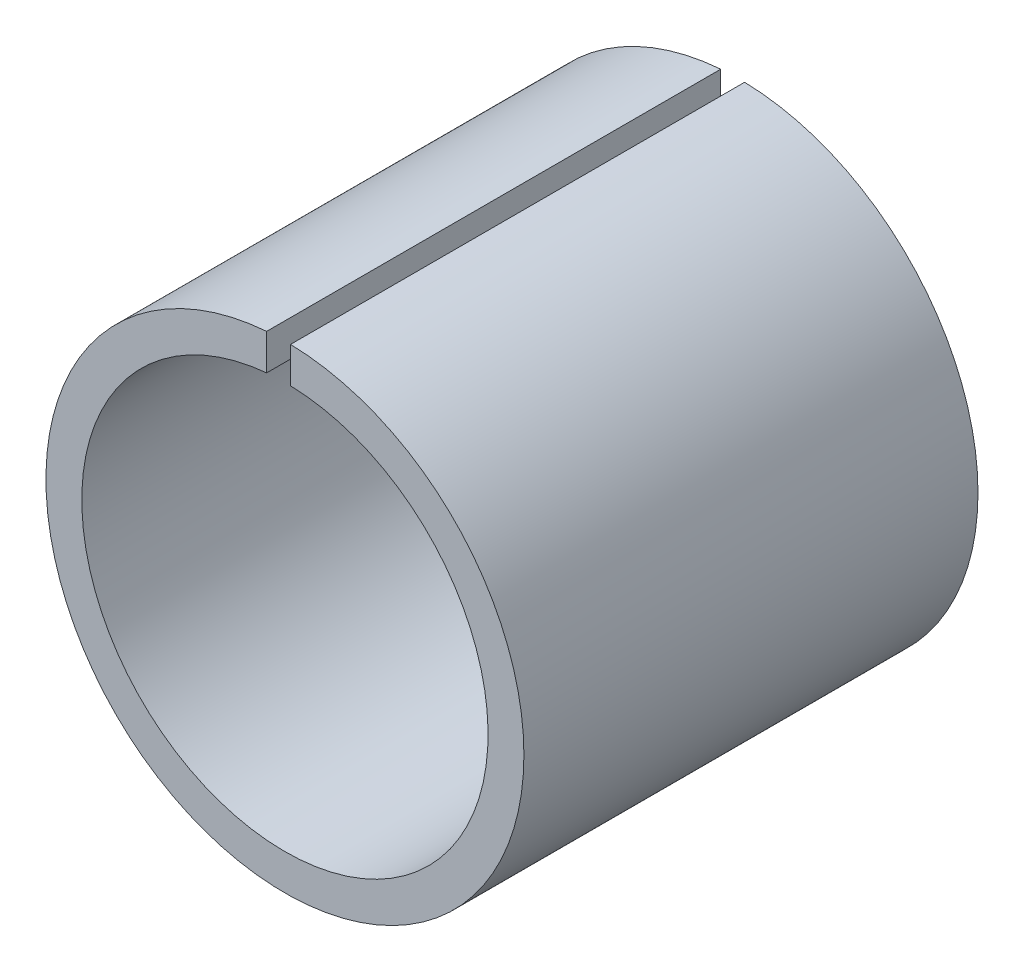
ISO-10303-21;
HEADER;
FILE_DESCRIPTION(('STEP AP214'),'2;1');
FILE_NAME('part.step','',(''),(''),'','','');
FILE_SCHEMA(('AUTOMOTIVE_DESIGN { 1 0 10303 214 1 1 1 1 }'));
ENDSEC;
DATA;
#1=APPLICATION_CONTEXT('core data for automotive mechanical design processes');
#2=APPLICATION_PROTOCOL_DEFINITION('international standard','automotive_design',2000,#1);
#3=PRODUCT_CONTEXT('',#1,'mechanical');
#4=PRODUCT('Part','Part','',(#3));
#5=PRODUCT_RELATED_PRODUCT_CATEGORY('part','',(#4));
#6=PRODUCT_DEFINITION_FORMATION('','',#4);
#7=PRODUCT_DEFINITION_CONTEXT('part definition',#1,'design');
#8=PRODUCT_DEFINITION('design','',#6,#7);
#9=PRODUCT_DEFINITION_SHAPE('','',#8);
#10=(LENGTH_UNIT() NAMED_UNIT(*) SI_UNIT(.MILLI.,.METRE.));
#11=(NAMED_UNIT(*) PLANE_ANGLE_UNIT() SI_UNIT($,.RADIAN.));
#12=(NAMED_UNIT(*) SI_UNIT($,.STERADIAN.) SOLID_ANGLE_UNIT());
#13=UNCERTAINTY_MEASURE_WITH_UNIT(LENGTH_MEASURE(1.E-05),#10,'distance_accuracy_value','');
#14=(GEOMETRIC_REPRESENTATION_CONTEXT(3) GLOBAL_UNCERTAINTY_ASSIGNED_CONTEXT((#13)) GLOBAL_UNIT_ASSIGNED_CONTEXT((#10,
#11,#12)) REPRESENTATION_CONTEXT('',''));
#15=CARTESIAN_POINT('',(0.,0.,0.));
#16=DIRECTION('',(0.,0.,1.));
#17=DIRECTION('',(1.,0.,0.));
#18=AXIS2_PLACEMENT_3D('',#15,#16,#17);
#19=CARTESIAN_POINT('',(0.,0.,19.));
#20=DIRECTION('',(0.,0.,-1.));
#21=DIRECTION('',(-1.,0.,0.));
#22=AXIS2_PLACEMENT_3D('',#19,#20,#21);
#23=CYLINDRICAL_SURFACE('',#22,10.);
#24=DIRECTION('',(0.,0.,-1.));
#25=VECTOR('',#24,1.);
#26=CARTESIAN_POINT('',(-0.765251335992105,9.97067652633272,19.));
#27=LINE('',#26,#25);
#28=CARTESIAN_POINT('',(-0.765251335992104,9.97067652633272,0.));
#29=VERTEX_POINT('',#28);
#30=CARTESIAN_POINT('',(-0.765251335992105,9.97067652633272,19.));
#31=VERTEX_POINT('',#30);
#32=EDGE_CURVE('E76',#29,#31,#27,.F.);
#33=ORIENTED_EDGE('',*,*,#32,.F.);
#34=CARTESIAN_POINT('',(0.,0.,0.));
#35=DIRECTION('',(0.,0.,1.));
#36=DIRECTION('',(1.,0.,0.));
#37=AXIS2_PLACEMENT_3D('',#34,#35,#36);
#38=CIRCLE('',#37,10.);
#39=CARTESIAN_POINT('',(0.234748664007892,9.99724427353591,0.));
#40=VERTEX_POINT('',#39);
#41=EDGE_CURVE('E86',#29,#40,#38,.T.);
#42=ORIENTED_EDGE('',*,*,#41,.T.);
#43=DIRECTION('',(0.,0.,-1.));
#44=VECTOR('',#43,1.);
#45=CARTESIAN_POINT('',(0.234748664007895,9.99724427353591,19.));
#46=LINE('',#45,#44);
#47=CARTESIAN_POINT('',(0.234748664007895,9.99724427353591,19.));
#48=VERTEX_POINT('',#47);
#49=EDGE_CURVE('E90',#48,#40,#46,.T.);
#50=ORIENTED_EDGE('',*,*,#49,.F.);
#51=CARTESIAN_POINT('',(0.,0.,19.));
#52=DIRECTION('',(0.,0.,1.));
#53=DIRECTION('',(1.,0.,0.));
#54=AXIS2_PLACEMENT_3D('',#51,#52,#53);
#55=CIRCLE('',#54,10.);
#56=EDGE_CURVE('E88',#31,#48,#55,.T.);
#57=ORIENTED_EDGE('',*,*,#56,.F.);
#58=EDGE_LOOP('',(#33,#42,#50,#57));
#59=FACE_BOUND('',#58,.T.);
#60=ADVANCED_FACE('F36',(#59),#23,.T.);
#61=CARTESIAN_POINT('',(0.,0.,19.));
#62=DIRECTION('',(0.,0.,1.));
#63=DIRECTION('',(1.,0.,0.));
#64=AXIS2_PLACEMENT_3D('',#61,#62,#63);
#65=PLANE('',#64);
#66=CARTESIAN_POINT('',(0.,0.,19.));
#67=DIRECTION('',(0.,0.,1.));
#68=DIRECTION('',(1.,0.,0.));
#69=AXIS2_PLACEMENT_3D('',#66,#67,#68);
#70=CIRCLE('',#69,8.5);
#71=CARTESIAN_POINT('',(-0.765251335992106,8.46548228943646,19.));
#72=VERTEX_POINT('',#71);
#73=CARTESIAN_POINT('',(0.234748664007895,8.49675779722751,19.));
#74=VERTEX_POINT('',#73);
#75=EDGE_CURVE('E89',#72,#74,#70,.T.);
#76=ORIENTED_EDGE('',*,*,#75,.F.);
#77=DIRECTION('',(0.,-1.,0.));
#78=VECTOR('',#77,1.);
#79=CARTESIAN_POINT('',(-0.765251335992105,11.,19.));
#80=LINE('',#79,#78);
#81=EDGE_CURVE('E49',#31,#72,#80,.T.);
#82=ORIENTED_EDGE('',*,*,#81,.F.);
#83=ORIENTED_EDGE('',*,*,#56,.T.);
#84=DIRECTION('',(0.,-1.,0.));
#85=VECTOR('',#84,1.);
#86=CARTESIAN_POINT('',(0.234748664007895,11.,19.));
#87=LINE('',#86,#85);
#88=EDGE_CURVE('E100',#48,#74,#87,.T.);
#89=ORIENTED_EDGE('',*,*,#88,.T.);
#90=EDGE_LOOP('',(#76,#82,#83,#89));
#91=FACE_BOUND('',#90,.T.);
#92=ADVANCED_FACE('F105',(#91),#65,.T.);
#93=CARTESIAN_POINT('',(0.,0.,0.));
#94=DIRECTION('',(0.,0.,1.));
#95=DIRECTION('',(1.,0.,0.));
#96=AXIS2_PLACEMENT_3D('',#93,#94,#95);
#97=PLANE('',#96);
#98=DIRECTION('',(0.,-1.,0.));
#99=VECTOR('',#98,1.);
#100=CARTESIAN_POINT('',(-0.765251335992104,11.,0.));
#101=LINE('',#100,#99);
#102=CARTESIAN_POINT('',(-0.765251335992104,8.46548228943645,0.));
#103=VERTEX_POINT('',#102);
#104=EDGE_CURVE('E73',#29,#103,#101,.T.);
#105=ORIENTED_EDGE('',*,*,#104,.T.);
#106=CARTESIAN_POINT('',(0.,0.,0.));
#107=DIRECTION('',(0.,0.,1.));
#108=DIRECTION('',(1.,0.,0.));
#109=AXIS2_PLACEMENT_3D('',#106,#107,#108);
#110=CIRCLE('',#109,8.5);
#111=CARTESIAN_POINT('',(0.234748664007892,8.49675779722751,0.));
#112=VERTEX_POINT('',#111);
#113=EDGE_CURVE('E93',#103,#112,#110,.T.);
#114=ORIENTED_EDGE('',*,*,#113,.T.);
#115=DIRECTION('',(0.,-1.,0.));
#116=VECTOR('',#115,1.);
#117=CARTESIAN_POINT('',(0.234748664007892,11.,0.));
#118=LINE('',#117,#116);
#119=EDGE_CURVE('E57',#40,#112,#118,.T.);
#120=ORIENTED_EDGE('',*,*,#119,.F.);
#121=ORIENTED_EDGE('',*,*,#41,.F.);
#122=EDGE_LOOP('',(#105,#114,#120,#121));
#123=FACE_BOUND('',#122,.T.);
#124=ADVANCED_FACE('F92',(#123),#97,.F.);
#125=CARTESIAN_POINT('',(0.,0.,0.));
#126=DIRECTION('',(0.,0.,1.));
#127=DIRECTION('',(1.,0.,0.));
#128=AXIS2_PLACEMENT_3D('',#125,#126,#127);
#129=CYLINDRICAL_SURFACE('',#128,8.5);
#130=DIRECTION('',(0.,0.,1.));
#131=VECTOR('',#130,1.);
#132=CARTESIAN_POINT('',(-0.765251335992104,8.46548228943645,0.));
#133=LINE('',#132,#131);
#134=EDGE_CURVE('E11',#72,#103,#133,.F.);
#135=ORIENTED_EDGE('',*,*,#134,.F.);
#136=ORIENTED_EDGE('',*,*,#75,.T.);
#137=DIRECTION('',(0.,0.,1.));
#138=VECTOR('',#137,1.);
#139=CARTESIAN_POINT('',(0.234748664007892,8.49675779722751,0.));
#140=LINE('',#139,#138);
#141=EDGE_CURVE('E43',#112,#74,#140,.T.);
#142=ORIENTED_EDGE('',*,*,#141,.F.);
#143=ORIENTED_EDGE('',*,*,#113,.F.);
#144=EDGE_LOOP('',(#135,#136,#142,#143));
#145=FACE_BOUND('',#144,.T.);
#146=ADVANCED_FACE('F107',(#145),#129,.F.);
#147=CARTESIAN_POINT('',(0.234748664007892,11.,0.));
#148=DIRECTION('',(-1.,0.,0.));
#149=DIRECTION('',(0.,0.,1.));
#150=AXIS2_PLACEMENT_3D('',#147,#148,#149);
#151=PLANE('',#150);
#152=ORIENTED_EDGE('',*,*,#49,.T.);
#153=ORIENTED_EDGE('',*,*,#119,.T.);
#154=ORIENTED_EDGE('',*,*,#141,.T.);
#155=ORIENTED_EDGE('',*,*,#88,.F.);
#156=EDGE_LOOP('',(#152,#153,#154,#155));
#157=FACE_BOUND('',#156,.T.);
#158=ADVANCED_FACE('F99',(#157),#151,.T.);
#159=CARTESIAN_POINT('',(-0.765251335992105,11.,19.));
#160=DIRECTION('',(1.,0.,0.));
#161=DIRECTION('',(0.,0.,-1.));
#162=AXIS2_PLACEMENT_3D('',#159,#160,#161);
#163=PLANE('',#162);
#164=ORIENTED_EDGE('',*,*,#32,.T.);
#165=ORIENTED_EDGE('',*,*,#81,.T.);
#166=ORIENTED_EDGE('',*,*,#134,.T.);
#167=ORIENTED_EDGE('',*,*,#104,.F.);
#168=EDGE_LOOP('',(#164,#165,#166,#167));
#169=FACE_BOUND('',#168,.T.);
#170=ADVANCED_FACE('F75',(#169),#163,.T.);
#171=CLOSED_SHELL('',(#60,#92,#124,#146,#158,#170));
#172=MANIFOLD_SOLID_BREP('B2',#171);
#173=ADVANCED_BREP_SHAPE_REPRESENTATION('',(#18,#172),#14);
#174=SHAPE_DEFINITION_REPRESENTATION(#9,#173);
ENDSEC;
END-ISO-10303-21;
